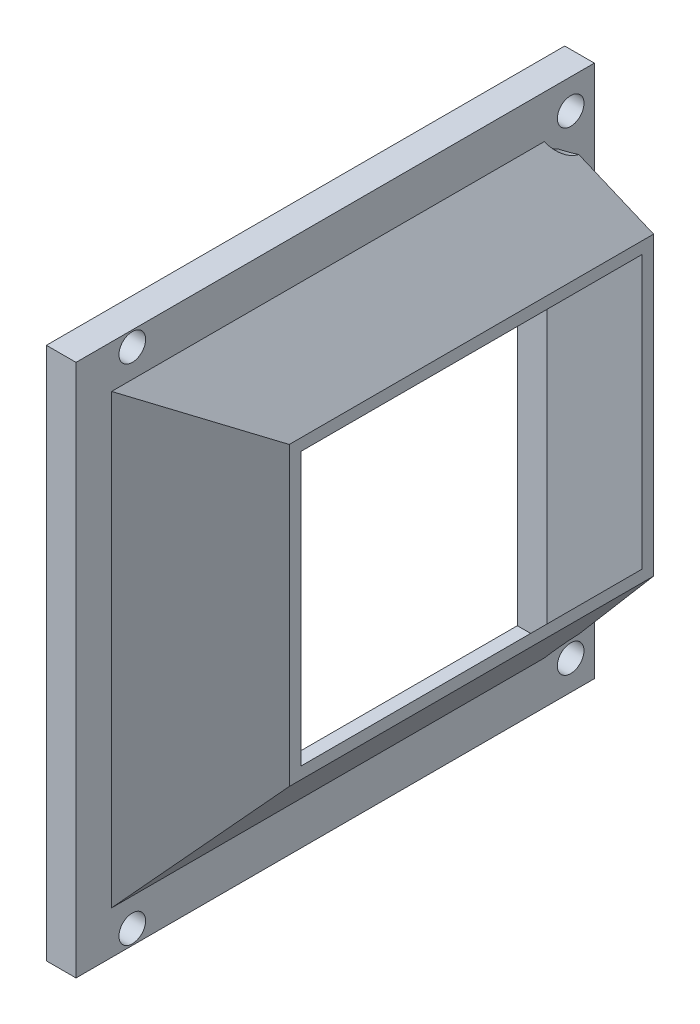
ISO-10303-21;
HEADER;
FILE_DESCRIPTION(('STEP AP214'),'2;1');
FILE_NAME('part.step','',(''),(''),'','','');
FILE_SCHEMA(('AUTOMOTIVE_DESIGN { 1 0 10303 214 1 1 1 1 }'));
ENDSEC;
DATA;
#1=APPLICATION_CONTEXT('core data for automotive mechanical design processes');
#2=APPLICATION_PROTOCOL_DEFINITION('international standard','automotive_design',2000,#1);
#3=PRODUCT_CONTEXT('',#1,'mechanical');
#4=PRODUCT('Part','Part','',(#3));
#5=PRODUCT_RELATED_PRODUCT_CATEGORY('part','',(#4));
#6=PRODUCT_DEFINITION_FORMATION('','',#4);
#7=PRODUCT_DEFINITION_CONTEXT('part definition',#1,'design');
#8=PRODUCT_DEFINITION('design','',#6,#7);
#9=PRODUCT_DEFINITION_SHAPE('','',#8);
#10=(LENGTH_UNIT() NAMED_UNIT(*) SI_UNIT(.MILLI.,.METRE.));
#11=(NAMED_UNIT(*) PLANE_ANGLE_UNIT() SI_UNIT($,.RADIAN.));
#12=(NAMED_UNIT(*) SI_UNIT($,.STERADIAN.) SOLID_ANGLE_UNIT());
#13=UNCERTAINTY_MEASURE_WITH_UNIT(LENGTH_MEASURE(1.E-05),#10,'distance_accuracy_value','');
#14=(GEOMETRIC_REPRESENTATION_CONTEXT(3) GLOBAL_UNCERTAINTY_ASSIGNED_CONTEXT((#13)) GLOBAL_UNIT_ASSIGNED_CONTEXT((#10,
#11,#12)) REPRESENTATION_CONTEXT('',''));
#15=CARTESIAN_POINT('',(0.,0.,0.));
#16=DIRECTION('',(0.,0.,1.));
#17=DIRECTION('',(1.,0.,0.));
#18=AXIS2_PLACEMENT_3D('',#15,#16,#17);
#19=CARTESIAN_POINT('',(15.,-45.,-43.75));
#20=DIRECTION('',(-0.514495755427526,0.,-0.857492925712544));
#21=DIRECTION('',(-0.857492925712544,0.,0.514495755427526));
#22=AXIS2_PLACEMENT_3D('',#19,#20,#21);
#23=PLANE('',#22);
#24=DIRECTION('',(0.,1.,0.));
#25=VECTOR('',#24,1.);
#26=CARTESIAN_POINT('',(5.,-45.,-37.75));
#27=LINE('',#26,#25);
#28=CARTESIAN_POINT('',(5.,-35.4174243050442,-37.75));
#29=VERTEX_POINT('',#28);
#30=CARTESIAN_POINT('',(5.,35.4174243050442,-37.75));
#31=VERTEX_POINT('',#30);
#32=EDGE_CURVE('E164',#29,#31,#27,.T.);
#33=ORIENTED_EDGE('',*,*,#32,.T.);
#34=CARTESIAN_POINT('',(8.33333333333333,40.,-39.75));
#35=DIRECTION('',(-0.514495755427526,0.,-0.857492925712544));
#36=DIRECTION('',(-0.857492925712544,0.,0.514495755427526));
#37=AXIS2_PLACEMENT_3D('',#34,#35,#36);
#38=ELLIPSE('',#37,9.71825315807549,5.);
#39=CARTESIAN_POINT('',(7.1147051926827,35.0537508793296,-39.0188231156096));
#40=VERTEX_POINT('',#39);
#41=EDGE_CURVE('E168',#31,#40,#38,.F.);
#42=ORIENTED_EDGE('',*,*,#41,.T.);
#43=DIRECTION('',(0.578738495143478,-0.737891581307935,-0.347243097086087));
#44=VECTOR('',#43,1.);
#45=CARTESIAN_POINT('',(-2.58425790244924,47.4199288256228,-33.1994452585305));
#46=LINE('',#45,#44);
#47=CARTESIAN_POINT('',(15.,25.0000000000001,-43.75));
#48=VERTEX_POINT('',#47);
#49=EDGE_CURVE('E323',#40,#48,#46,.T.);
#50=ORIENTED_EDGE('',*,*,#49,.T.);
#51=DIRECTION('',(0.,-1.,0.));
#52=VECTOR('',#51,1.);
#53=CARTESIAN_POINT('',(15.,23.,-43.75));
#54=LINE('',#53,#52);
#55=CARTESIAN_POINT('',(15.,-25.,-43.75));
#56=VERTEX_POINT('',#55);
#57=EDGE_CURVE('E330',#48,#56,#54,.T.);
#58=ORIENTED_EDGE('',*,*,#57,.T.);
#59=DIRECTION('',(-0.578738495143478,-0.737891581307935,0.347243097086087));
#60=VECTOR('',#59,1.);
#61=CARTESIAN_POINT('',(-11.3784802177099,-58.6325622775801,-27.9229118693741));
#62=LINE('',#61,#60);
#63=CARTESIAN_POINT('',(7.11470519268268,-35.0537508793296,-39.0188231156096));
#64=VERTEX_POINT('',#63);
#65=EDGE_CURVE('E166',#56,#64,#62,.T.);
#66=ORIENTED_EDGE('',*,*,#65,.T.);
#67=CARTESIAN_POINT('',(8.33333333333333,-40.,-39.75));
#68=DIRECTION('',(-0.514495755427526,0.,-0.857492925712544));
#69=DIRECTION('',(-0.857492925712544,0.,0.514495755427526));
#70=AXIS2_PLACEMENT_3D('',#67,#68,#69);
#71=ELLIPSE('',#70,9.71825315807549,5.);
#72=EDGE_CURVE('E154',#64,#29,#71,.F.);
#73=ORIENTED_EDGE('',*,*,#72,.T.);
#74=EDGE_LOOP('',(#33,#42,#50,#58,#66,#73));
#75=FACE_BOUND('',#74,.T.);
#76=ADVANCED_FACE('F38',(#75),#23,.T.);
#77=CARTESIAN_POINT('',(15.,25.,43.75));
#78=DIRECTION('',(0.786853417355905,0.617139935181102,0.));
#79=DIRECTION('',(-0.617139935181102,0.786853417355905,0.));
#80=AXIS2_PLACEMENT_3D('',#77,#78,#79);
#81=PLANE('',#80);
#82=ORIENTED_EDGE('',*,*,#49,.F.);
#83=CARTESIAN_POINT('',(3.23529411764705,40.,-39.75));
#84=DIRECTION('',(0.786853417355905,0.617139935181102,0.));
#85=DIRECTION('',(-0.617139935181102,0.786853417355905,0.));
#86=AXIS2_PLACEMENT_3D('',#83,#84,#85);
#87=ELLIPSE('',#86,6.35442369533286,5.);
#88=CARTESIAN_POINT('',(5.,37.75,-35.2848572251271));
#89=VERTEX_POINT('',#88);
#90=EDGE_CURVE('E11',#40,#89,#87,.F.);
#91=ORIENTED_EDGE('',*,*,#90,.T.);
#92=DIRECTION('',(0.,0.,-1.));
#93=VECTOR('',#92,1.);
#94=CARTESIAN_POINT('',(5.,37.75,43.75));
#95=LINE('',#94,#93);
#96=CARTESIAN_POINT('',(5.,37.75,37.75));
#97=VERTEX_POINT('',#96);
#98=EDGE_CURVE('E333',#97,#89,#95,.T.);
#99=ORIENTED_EDGE('',*,*,#98,.F.);
#100=DIRECTION('',(-0.388496020091119,0.495332425616176,0.776992040182238));
#101=VECTOR('',#100,1.);
#102=CARTESIAN_POINT('',(7.15168380341477,35.0066031506462,33.4466323931704));
#103=LINE('',#102,#101);
#104=CARTESIAN_POINT('',(15.,25.,17.75));
#105=VERTEX_POINT('',#104);
#106=EDGE_CURVE('E356',#105,#97,#103,.T.);
#107=ORIENTED_EDGE('',*,*,#106,.F.);
#108=DIRECTION('',(0.,0.,-1.));
#109=VECTOR('',#108,1.);
#110=CARTESIAN_POINT('',(15.,25.,43.75));
#111=LINE('',#110,#109);
#112=EDGE_CURVE('E339',#105,#48,#111,.T.);
#113=ORIENTED_EDGE('',*,*,#112,.T.);
#114=EDGE_LOOP('',(#82,#91,#99,#107,#113));
#115=FACE_BOUND('',#114,.T.);
#116=ADVANCED_FACE('F362',(#115),#81,.T.);
#117=CARTESIAN_POINT('',(5.,-37.75,43.75));
#118=DIRECTION('',(0.786853417355905,-0.617139935181102,0.));
#119=DIRECTION('',(0.617139935181102,0.786853417355905,0.));
#120=AXIS2_PLACEMENT_3D('',#117,#118,#119);
#121=PLANE('',#120);
#122=DIRECTION('',(0.,0.,-1.));
#123=VECTOR('',#122,1.);
#124=CARTESIAN_POINT('',(5.,-37.75,43.75));
#125=LINE('',#124,#123);
#126=CARTESIAN_POINT('',(5.,-37.75,37.75));
#127=VERTEX_POINT('',#126);
#128=CARTESIAN_POINT('',(5.,-37.75,-35.2848572251271));
#129=VERTEX_POINT('',#128);
#130=EDGE_CURVE('E310',#127,#129,#125,.T.);
#131=ORIENTED_EDGE('',*,*,#130,.T.);
#132=CARTESIAN_POINT('',(3.23529411764704,-40.,-39.75));
#133=DIRECTION('',(0.786853417355905,-0.617139935181102,0.));
#134=DIRECTION('',(-0.617139935181102,-0.786853417355905,0.));
#135=AXIS2_PLACEMENT_3D('',#132,#133,#134);
#136=ELLIPSE('',#135,6.35442369533286,5.);
#137=EDGE_CURVE('E47',#129,#64,#136,.F.);
#138=ORIENTED_EDGE('',*,*,#137,.T.);
#139=ORIENTED_EDGE('',*,*,#65,.F.);
#140=DIRECTION('',(0.,0.,-1.));
#141=VECTOR('',#140,1.);
#142=CARTESIAN_POINT('',(15.,-25.,43.75));
#143=LINE('',#142,#141);
#144=CARTESIAN_POINT('',(15.,-25.,17.75));
#145=VERTEX_POINT('',#144);
#146=EDGE_CURVE('E314',#145,#56,#143,.T.);
#147=ORIENTED_EDGE('',*,*,#146,.F.);
#148=DIRECTION('',(0.388496020091119,0.495332425616176,-0.776992040182238));
#149=VECTOR('',#148,1.);
#150=CARTESIAN_POINT('',(3.18885010848033,-40.0592161116876,41.3722997830393));
#151=LINE('',#150,#149);
#152=EDGE_CURVE('E311',#127,#145,#151,.T.);
#153=ORIENTED_EDGE('',*,*,#152,.F.);
#154=EDGE_LOOP('',(#131,#138,#139,#147,#153));
#155=FACE_BOUND('',#154,.T.);
#156=ADVANCED_FACE('F306',(#155),#121,.T.);
#157=CARTESIAN_POINT('',(5.,-45.,-35.75));
#158=DIRECTION('',(0.514495755427526,0.,0.857492925712544));
#159=DIRECTION('',(0.857492925712544,0.,-0.514495755427526));
#160=AXIS2_PLACEMENT_3D('',#157,#158,#159);
#161=PLANE('',#160);
#162=DIRECTION('',(-0.578738495143478,-0.737891581307935,0.347243097086087));
#163=VECTOR('',#162,1.);
#164=CARTESIAN_POINT('',(1.04982206405694,-40.7864768683274,-33.3798932384342));
#165=LINE('',#164,#163);
#166=CARTESIAN_POINT('',(15.,-23.,-41.75));
#167=VERTEX_POINT('',#166);
#168=CARTESIAN_POINT('',(5.,-35.75,-35.75));
#169=VERTEX_POINT('',#168);
#170=EDGE_CURVE('E318',#167,#169,#165,.T.);
#171=ORIENTED_EDGE('',*,*,#170,.F.);
#172=DIRECTION('',(0.,1.,0.));
#173=VECTOR('',#172,1.);
#174=CARTESIAN_POINT('',(15.,-45.,-41.75));
#175=LINE('',#174,#173);
#176=CARTESIAN_POINT('',(15.,23.,-41.75));
#177=VERTEX_POINT('',#176);
#178=EDGE_CURVE('E187',#167,#177,#175,.T.);
#179=ORIENTED_EDGE('',*,*,#178,.T.);
#180=DIRECTION('',(0.578738495143478,-0.737891581307935,-0.347243097086087));
#181=VECTOR('',#180,1.);
#182=CARTESIAN_POINT('',(39.4839857651246,-8.2170818505338,-56.4403914590747));
#183=LINE('',#182,#181);
#184=CARTESIAN_POINT('',(5.,35.7499999999999,-35.75));
#185=VERTEX_POINT('',#184);
#186=EDGE_CURVE('E348',#185,#177,#183,.T.);
#187=ORIENTED_EDGE('',*,*,#186,.F.);
#188=DIRECTION('',(0.,1.,0.));
#189=VECTOR('',#188,1.);
#190=CARTESIAN_POINT('',(5.,-35.75,-35.75));
#191=LINE('',#190,#189);
#192=EDGE_CURVE('E224',#169,#185,#191,.T.);
#193=ORIENTED_EDGE('',*,*,#192,.F.);
#194=EDGE_LOOP('',(#171,#179,#187,#193));
#195=FACE_BOUND('',#194,.T.);
#196=ADVANCED_FACE('F385',(#195),#161,.T.);
#197=CARTESIAN_POINT('',(5.,-45.,35.75));
#198=DIRECTION('',(-0.894427190999916,0.,-0.447213595499958));
#199=DIRECTION('',(-0.447213595499958,0.,0.894427190999916));
#200=AXIS2_PLACEMENT_3D('',#197,#198,#199);
#201=PLANE('',#200);
#202=DIRECTION('',(0.388496020091119,0.495332425616176,-0.776992040182238));
#203=VECTOR('',#202,1.);
#204=CARTESIAN_POINT('',(3.21997924724083,-38.0195264597679,39.3100415055183));
#205=LINE('',#204,#203);
#206=CARTESIAN_POINT('',(5.,-35.75,35.75));
#207=VERTEX_POINT('',#206);
#208=CARTESIAN_POINT('',(15.,-23.,15.75));
#209=VERTEX_POINT('',#208);
#210=EDGE_CURVE('E313',#207,#209,#205,.T.);
#211=ORIENTED_EDGE('',*,*,#210,.F.);
#212=DIRECTION('',(0.,-1.,0.));
#213=VECTOR('',#212,1.);
#214=CARTESIAN_POINT('',(5.,-35.75,35.75));
#215=LINE('',#214,#213);
#216=CARTESIAN_POINT('',(5.,35.75,35.75));
#217=VERTEX_POINT('',#216);
#218=EDGE_CURVE('E233',#217,#207,#215,.T.);
#219=ORIENTED_EDGE('',*,*,#218,.F.);
#220=DIRECTION('',(-0.388496020091119,0.495332425616176,0.776992040182238));
#221=VECTOR('',#220,1.);
#222=CARTESIAN_POINT('',(20.5391000848976,15.9376473917555,4.67179983020469));
#223=LINE('',#222,#221);
#224=CARTESIAN_POINT('',(15.,23.,15.75));
#225=VERTEX_POINT('',#224);
#226=EDGE_CURVE('E338',#225,#217,#223,.T.);
#227=ORIENTED_EDGE('',*,*,#226,.F.);
#228=DIRECTION('',(0.,1.,0.));
#229=VECTOR('',#228,1.);
#230=CARTESIAN_POINT('',(15.,-45.,15.75));
#231=LINE('',#230,#229);
#232=EDGE_CURVE('E191',#209,#225,#231,.T.);
#233=ORIENTED_EDGE('',*,*,#232,.F.);
#234=EDGE_LOOP('',(#211,#219,#227,#233));
#235=FACE_BOUND('',#234,.T.);
#236=ADVANCED_FACE('F410',(#235),#201,.T.);
#237=CARTESIAN_POINT('',(15.,-45.,17.75));
#238=DIRECTION('',(0.894427190999916,0.,0.447213595499958));
#239=DIRECTION('',(0.447213595499958,0.,-0.894427190999916));
#240=AXIS2_PLACEMENT_3D('',#237,#238,#239);
#241=PLANE('',#240);
#242=DIRECTION('',(0.,1.,0.));
#243=VECTOR('',#242,1.);
#244=CARTESIAN_POINT('',(5.,-45.,37.75));
#245=LINE('',#244,#243);
#246=EDGE_CURVE('E185',#127,#97,#245,.T.);
#247=ORIENTED_EDGE('',*,*,#246,.F.);
#248=ORIENTED_EDGE('',*,*,#152,.T.);
#249=DIRECTION('',(0.,1.,0.));
#250=VECTOR('',#249,1.);
#251=CARTESIAN_POINT('',(15.,-45.,17.75));
#252=LINE('',#251,#250);
#253=EDGE_CURVE('E62',#145,#105,#252,.T.);
#254=ORIENTED_EDGE('',*,*,#253,.T.);
#255=ORIENTED_EDGE('',*,*,#106,.T.);
#256=EDGE_LOOP('',(#247,#248,#254,#255));
#257=FACE_BOUND('',#256,.T.);
#258=ADVANCED_FACE('F357',(#257),#241,.T.);
#259=CARTESIAN_POINT('',(5.,0.,0.));
#260=DIRECTION('',(-1.,0.,0.));
#261=DIRECTION('',(0.,0.,1.));
#262=AXIS2_PLACEMENT_3D('',#259,#260,#261);
#263=PLANE('',#262);
#264=CARTESIAN_POINT('',(5.,40.,-39.75));
#265=DIRECTION('',(1.,0.,0.));
#266=DIRECTION('',(0.,0.,-1.));
#267=AXIS2_PLACEMENT_3D('',#264,#265,#266);
#268=CIRCLE('',#267,5.);
#269=EDGE_CURVE('E158',#89,#31,#268,.T.);
#270=ORIENTED_EDGE('',*,*,#269,.T.);
#271=ORIENTED_EDGE('',*,*,#32,.F.);
#272=CARTESIAN_POINT('',(5.,-40.,-39.75));
#273=DIRECTION('',(1.,0.,0.));
#274=DIRECTION('',(0.,0.,-1.));
#275=AXIS2_PLACEMENT_3D('',#272,#273,#274);
#276=CIRCLE('',#275,5.);
#277=EDGE_CURVE('E54',#29,#129,#276,.T.);
#278=ORIENTED_EDGE('',*,*,#277,.T.);
#279=ORIENTED_EDGE('',*,*,#130,.F.);
#280=ORIENTED_EDGE('',*,*,#246,.T.);
#281=ORIENTED_EDGE('',*,*,#98,.T.);
#282=EDGE_LOOP('',(#270,#271,#278,#279,#280,#281));
#283=FACE_BOUND('',#282,.T.);
#284=DIRECTION('',(0.,1.,0.));
#285=VECTOR('',#284,1.);
#286=CARTESIAN_POINT('',(5.,-45.,-43.75));
#287=LINE('',#286,#285);
#288=CARTESIAN_POINT('',(5.,-45.,-43.75));
#289=VERTEX_POINT('',#288);
#290=CARTESIAN_POINT('',(5.,45.,-43.75));
#291=VERTEX_POINT('',#290);
#292=EDGE_CURVE('E270',#289,#291,#287,.T.);
#293=ORIENTED_EDGE('',*,*,#292,.T.);
#294=DIRECTION('',(0.,0.,1.));
#295=VECTOR('',#294,1.);
#296=CARTESIAN_POINT('',(5.,45.,43.75));
#297=LINE('',#296,#295);
#298=CARTESIAN_POINT('',(5.,45.,43.75));
#299=VERTEX_POINT('',#298);
#300=EDGE_CURVE('E273',#291,#299,#297,.T.);
#301=ORIENTED_EDGE('',*,*,#300,.T.);
#302=DIRECTION('',(0.,-1.,0.));
#303=VECTOR('',#302,1.);
#304=CARTESIAN_POINT('',(5.,-45.,43.75));
#305=LINE('',#304,#303);
#306=CARTESIAN_POINT('',(5.,-45.,43.75));
#307=VERTEX_POINT('',#306);
#308=EDGE_CURVE('E277',#299,#307,#305,.T.);
#309=ORIENTED_EDGE('',*,*,#308,.T.);
#310=DIRECTION('',(0.,0.,-1.));
#311=VECTOR('',#310,1.);
#312=CARTESIAN_POINT('',(5.,-45.,43.75));
#313=LINE('',#312,#311);
#314=EDGE_CURVE('E280',#307,#289,#313,.T.);
#315=ORIENTED_EDGE('',*,*,#314,.T.);
#316=EDGE_LOOP('',(#293,#301,#309,#315));
#317=FACE_BOUND('',#316,.T.);
#318=CARTESIAN_POINT('',(5.,42.5,34.25));
#319=DIRECTION('',(1.,0.,0.));
#320=DIRECTION('',(0.,0.,-1.));
#321=AXIS2_PLACEMENT_3D('',#318,#319,#320);
#322=CIRCLE('',#321,2.24999999999999);
#323=CARTESIAN_POINT('',(5.,42.5,32.));
#324=VERTEX_POINT('',#323);
#325=EDGE_CURVE('E207',#324,#324,#322,.T.);
#326=ORIENTED_EDGE('',*,*,#325,.F.);
#327=EDGE_LOOP('',(#326));
#328=FACE_BOUND('',#327,.T.);
#329=CARTESIAN_POINT('',(5.,-42.5,34.25));
#330=DIRECTION('',(1.,0.,0.));
#331=DIRECTION('',(0.,0.,-1.));
#332=AXIS2_PLACEMENT_3D('',#329,#330,#331);
#333=CIRCLE('',#332,2.24999999999999);
#334=CARTESIAN_POINT('',(5.,-42.5,32.));
#335=VERTEX_POINT('',#334);
#336=EDGE_CURVE('E190',#335,#335,#333,.T.);
#337=ORIENTED_EDGE('',*,*,#336,.F.);
#338=EDGE_LOOP('',(#337));
#339=FACE_BOUND('',#338,.T.);
#340=CARTESIAN_POINT('',(5.,-40.,-39.75));
#341=DIRECTION('',(1.,0.,0.));
#342=DIRECTION('',(0.,0.,-1.));
#343=AXIS2_PLACEMENT_3D('',#340,#341,#342);
#344=CIRCLE('',#343,2.24999999999999);
#345=CARTESIAN_POINT('',(5.,-40.,-42.));
#346=VERTEX_POINT('',#345);
#347=EDGE_CURVE('E199',#346,#346,#344,.T.);
#348=ORIENTED_EDGE('',*,*,#347,.F.);
#349=EDGE_LOOP('',(#348));
#350=FACE_BOUND('',#349,.T.);
#351=CARTESIAN_POINT('',(5.,40.,-39.75));
#352=DIRECTION('',(1.,0.,0.));
#353=DIRECTION('',(0.,0.,-1.));
#354=AXIS2_PLACEMENT_3D('',#351,#352,#353);
#355=CIRCLE('',#354,2.24999999999999);
#356=CARTESIAN_POINT('',(5.,40.,-42.));
#357=VERTEX_POINT('',#356);
#358=EDGE_CURVE('E215',#357,#357,#355,.T.);
#359=ORIENTED_EDGE('',*,*,#358,.F.);
#360=EDGE_LOOP('',(#359));
#361=FACE_BOUND('',#360,.T.);
#362=ADVANCED_FACE('F171',(#283,#317,#328,#339,#350,#361),#263,.F.);
#363=CARTESIAN_POINT('',(0.,0.,0.));
#364=DIRECTION('',(-1.,0.,0.));
#365=DIRECTION('',(0.,0.,1.));
#366=AXIS2_PLACEMENT_3D('',#363,#364,#365);
#367=PLANE('',#366);
#368=CARTESIAN_POINT('',(0.,-42.5,34.25));
#369=DIRECTION('',(1.,0.,0.));
#370=DIRECTION('',(0.,0.,-1.));
#371=AXIS2_PLACEMENT_3D('',#368,#369,#370);
#372=CIRCLE('',#371,2.25);
#373=CARTESIAN_POINT('',(0.,-42.5,32.));
#374=VERTEX_POINT('',#373);
#375=EDGE_CURVE('E195',#374,#374,#372,.T.);
#376=ORIENTED_EDGE('',*,*,#375,.T.);
#377=EDGE_LOOP('',(#376));
#378=FACE_BOUND('',#377,.T.);
#379=CARTESIAN_POINT('',(0.,-40.,-39.75));
#380=DIRECTION('',(1.,0.,0.));
#381=DIRECTION('',(0.,0.,-1.));
#382=AXIS2_PLACEMENT_3D('',#379,#380,#381);
#383=CIRCLE('',#382,2.25);
#384=CARTESIAN_POINT('',(0.,-40.,-42.));
#385=VERTEX_POINT('',#384);
#386=EDGE_CURVE('E203',#385,#385,#383,.T.);
#387=ORIENTED_EDGE('',*,*,#386,.T.);
#388=EDGE_LOOP('',(#387));
#389=FACE_BOUND('',#388,.T.);
#390=CARTESIAN_POINT('',(0.,42.5,34.25));
#391=DIRECTION('',(1.,0.,0.));
#392=DIRECTION('',(0.,0.,-1.));
#393=AXIS2_PLACEMENT_3D('',#390,#391,#392);
#394=CIRCLE('',#393,2.25);
#395=CARTESIAN_POINT('',(0.,42.5,32.));
#396=VERTEX_POINT('',#395);
#397=EDGE_CURVE('E211',#396,#396,#394,.T.);
#398=ORIENTED_EDGE('',*,*,#397,.T.);
#399=EDGE_LOOP('',(#398));
#400=FACE_BOUND('',#399,.T.);
#401=CARTESIAN_POINT('',(0.,40.,-39.75));
#402=DIRECTION('',(1.,0.,0.));
#403=DIRECTION('',(0.,0.,-1.));
#404=AXIS2_PLACEMENT_3D('',#401,#402,#403);
#405=CIRCLE('',#404,2.25);
#406=CARTESIAN_POINT('',(0.,40.,-42.));
#407=VERTEX_POINT('',#406);
#408=EDGE_CURVE('E219',#407,#407,#405,.T.);
#409=ORIENTED_EDGE('',*,*,#408,.T.);
#410=EDGE_LOOP('',(#409));
#411=FACE_BOUND('',#410,.T.);
#412=DIRECTION('',(0.,1.,0.));
#413=VECTOR('',#412,1.);
#414=CARTESIAN_POINT('',(0.,-45.,-43.75));
#415=LINE('',#414,#413);
#416=CARTESIAN_POINT('',(0.,-45.,-43.75));
#417=VERTEX_POINT('',#416);
#418=CARTESIAN_POINT('',(0.,45.,-43.75));
#419=VERTEX_POINT('',#418);
#420=EDGE_CURVE('E269',#417,#419,#415,.T.);
#421=ORIENTED_EDGE('',*,*,#420,.F.);
#422=DIRECTION('',(0.,0.,-1.));
#423=VECTOR('',#422,1.);
#424=CARTESIAN_POINT('',(0.,-45.,43.75));
#425=LINE('',#424,#423);
#426=CARTESIAN_POINT('',(0.,-45.,43.75));
#427=VERTEX_POINT('',#426);
#428=EDGE_CURVE('E274',#427,#417,#425,.T.);
#429=ORIENTED_EDGE('',*,*,#428,.F.);
#430=DIRECTION('',(0.,-1.,0.));
#431=VECTOR('',#430,1.);
#432=CARTESIAN_POINT('',(0.,-45.,43.75));
#433=LINE('',#432,#431);
#434=CARTESIAN_POINT('',(0.,45.,43.75));
#435=VERTEX_POINT('',#434);
#436=EDGE_CURVE('E290',#435,#427,#433,.T.);
#437=ORIENTED_EDGE('',*,*,#436,.F.);
#438=DIRECTION('',(0.,0.,1.));
#439=VECTOR('',#438,1.);
#440=CARTESIAN_POINT('',(0.,45.,43.75));
#441=LINE('',#440,#439);
#442=EDGE_CURVE('E287',#419,#435,#441,.T.);
#443=ORIENTED_EDGE('',*,*,#442,.F.);
#444=EDGE_LOOP('',(#421,#429,#437,#443));
#445=FACE_BOUND('',#444,.T.);
#446=DIRECTION('',(0.,0.,-1.));
#447=VECTOR('',#446,1.);
#448=CARTESIAN_POINT('',(0.,-35.75,35.75));
#449=LINE('',#448,#447);
#450=CARTESIAN_POINT('',(0.,-35.75,35.75));
#451=VERTEX_POINT('',#450);
#452=CARTESIAN_POINT('',(0.,-35.75,-35.75));
#453=VERTEX_POINT('',#452);
#454=EDGE_CURVE('E229',#451,#453,#449,.T.);
#455=ORIENTED_EDGE('',*,*,#454,.T.);
#456=DIRECTION('',(0.,1.,0.));
#457=VECTOR('',#456,1.);
#458=CARTESIAN_POINT('',(0.,-35.75,-35.75));
#459=LINE('',#458,#457);
#460=CARTESIAN_POINT('',(0.,35.75,-35.75));
#461=VERTEX_POINT('',#460);
#462=EDGE_CURVE('E223',#453,#461,#459,.T.);
#463=ORIENTED_EDGE('',*,*,#462,.T.);
#464=DIRECTION('',(0.,0.,1.));
#465=VECTOR('',#464,1.);
#466=CARTESIAN_POINT('',(0.,35.75,35.75));
#467=LINE('',#466,#465);
#468=CARTESIAN_POINT('',(0.,35.75,35.75));
#469=VERTEX_POINT('',#468);
#470=EDGE_CURVE('E245',#461,#469,#467,.T.);
#471=ORIENTED_EDGE('',*,*,#470,.T.);
#472=DIRECTION('',(0.,-1.,0.));
#473=VECTOR('',#472,1.);
#474=CARTESIAN_POINT('',(0.,-35.75,35.75));
#475=LINE('',#474,#473);
#476=EDGE_CURVE('E249',#469,#451,#475,.T.);
#477=ORIENTED_EDGE('',*,*,#476,.T.);
#478=EDGE_LOOP('',(#455,#463,#471,#477));
#479=FACE_BOUND('',#478,.T.);
#480=ADVANCED_FACE('F400',(#378,#389,#400,#411,#445,#479),#367,.T.);
#481=CARTESIAN_POINT('',(5.,-45.,-43.75));
#482=DIRECTION('',(0.,0.,1.));
#483=DIRECTION('',(1.,0.,0.));
#484=AXIS2_PLACEMENT_3D('',#481,#482,#483);
#485=PLANE('',#484);
#486=DIRECTION('',(-1.,0.,0.));
#487=VECTOR('',#486,1.);
#488=CARTESIAN_POINT('',(5.,45.,-43.75));
#489=LINE('',#488,#487);
#490=EDGE_CURVE('E175',#291,#419,#489,.T.);
#491=ORIENTED_EDGE('',*,*,#490,.F.);
#492=ORIENTED_EDGE('',*,*,#292,.F.);
#493=DIRECTION('',(-1.,0.,0.));
#494=VECTOR('',#493,1.);
#495=CARTESIAN_POINT('',(5.,-45.,-43.75));
#496=LINE('',#495,#494);
#497=EDGE_CURVE('E283',#289,#417,#496,.T.);
#498=ORIENTED_EDGE('',*,*,#497,.T.);
#499=ORIENTED_EDGE('',*,*,#420,.T.);
#500=EDGE_LOOP('',(#491,#492,#498,#499));
#501=FACE_BOUND('',#500,.T.);
#502=ADVANCED_FACE('F40',(#501),#485,.F.);
#503=CARTESIAN_POINT('',(5.,45.,43.75));
#504=DIRECTION('',(0.,-1.,0.));
#505=DIRECTION('',(0.,0.,-1.));
#506=AXIS2_PLACEMENT_3D('',#503,#504,#505);
#507=PLANE('',#506);
#508=DIRECTION('',(-1.,0.,0.));
#509=VECTOR('',#508,1.);
#510=CARTESIAN_POINT('',(5.,45.,43.75));
#511=LINE('',#510,#509);
#512=EDGE_CURVE('E181',#299,#435,#511,.T.);
#513=ORIENTED_EDGE('',*,*,#512,.F.);
#514=ORIENTED_EDGE('',*,*,#300,.F.);
#515=ORIENTED_EDGE('',*,*,#490,.T.);
#516=ORIENTED_EDGE('',*,*,#442,.T.);
#517=EDGE_LOOP('',(#513,#514,#515,#516));
#518=FACE_BOUND('',#517,.T.);
#519=ADVANCED_FACE('F461',(#518),#507,.F.);
#520=CARTESIAN_POINT('',(5.,-45.,43.75));
#521=DIRECTION('',(0.,0.,-1.));
#522=DIRECTION('',(-1.,0.,0.));
#523=AXIS2_PLACEMENT_3D('',#520,#521,#522);
#524=PLANE('',#523);
#525=DIRECTION('',(-1.,0.,0.));
#526=VECTOR('',#525,1.);
#527=CARTESIAN_POINT('',(5.,-45.,43.75));
#528=LINE('',#527,#526);
#529=EDGE_CURVE('E298',#307,#427,#528,.T.);
#530=ORIENTED_EDGE('',*,*,#529,.F.);
#531=ORIENTED_EDGE('',*,*,#308,.F.);
#532=ORIENTED_EDGE('',*,*,#512,.T.);
#533=ORIENTED_EDGE('',*,*,#436,.T.);
#534=EDGE_LOOP('',(#530,#531,#532,#533));
#535=FACE_BOUND('',#534,.T.);
#536=ADVANCED_FACE('F458',(#535),#524,.F.);
#537=CARTESIAN_POINT('',(5.,-45.,43.75));
#538=DIRECTION('',(0.,1.,0.));
#539=DIRECTION('',(0.,0.,1.));
#540=AXIS2_PLACEMENT_3D('',#537,#538,#539);
#541=PLANE('',#540);
#542=ORIENTED_EDGE('',*,*,#497,.F.);
#543=ORIENTED_EDGE('',*,*,#314,.F.);
#544=ORIENTED_EDGE('',*,*,#529,.T.);
#545=ORIENTED_EDGE('',*,*,#428,.T.);
#546=EDGE_LOOP('',(#542,#543,#544,#545));
#547=FACE_BOUND('',#546,.T.);
#548=ADVANCED_FACE('F450',(#547),#541,.F.);
#549=CARTESIAN_POINT('',(5.,-35.75,-35.75));
#550=DIRECTION('',(0.,0.,1.));
#551=DIRECTION('',(1.,0.,0.));
#552=AXIS2_PLACEMENT_3D('',#549,#550,#551);
#553=PLANE('',#552);
#554=ORIENTED_EDGE('',*,*,#462,.F.);
#555=DIRECTION('',(-1.,0.,0.));
#556=VECTOR('',#555,1.);
#557=CARTESIAN_POINT('',(5.,-35.75,-35.75));
#558=LINE('',#557,#556);
#559=EDGE_CURVE('E241',#169,#453,#558,.T.);
#560=ORIENTED_EDGE('',*,*,#559,.F.);
#561=ORIENTED_EDGE('',*,*,#192,.T.);
#562=DIRECTION('',(-1.,0.,0.));
#563=VECTOR('',#562,1.);
#564=CARTESIAN_POINT('',(5.,35.75,-35.75));
#565=LINE('',#564,#563);
#566=EDGE_CURVE('E265',#185,#461,#565,.T.);
#567=ORIENTED_EDGE('',*,*,#566,.T.);
#568=EDGE_LOOP('',(#554,#560,#561,#567));
#569=FACE_BOUND('',#568,.T.);
#570=ADVANCED_FACE('F402',(#569),#553,.T.);
#571=CARTESIAN_POINT('',(5.,35.75,35.75));
#572=DIRECTION('',(0.,-1.,0.));
#573=DIRECTION('',(0.,0.,-1.));
#574=AXIS2_PLACEMENT_3D('',#571,#572,#573);
#575=PLANE('',#574);
#576=ORIENTED_EDGE('',*,*,#470,.F.);
#577=ORIENTED_EDGE('',*,*,#566,.F.);
#578=DIRECTION('',(0.,0.,1.));
#579=VECTOR('',#578,1.);
#580=CARTESIAN_POINT('',(5.,35.75,35.75));
#581=LINE('',#580,#579);
#582=EDGE_CURVE('E228',#185,#217,#581,.T.);
#583=ORIENTED_EDGE('',*,*,#582,.T.);
#584=DIRECTION('',(-1.,0.,0.));
#585=VECTOR('',#584,1.);
#586=CARTESIAN_POINT('',(5.,35.75,35.75));
#587=LINE('',#586,#585);
#588=EDGE_CURVE('E262',#217,#469,#587,.T.);
#589=ORIENTED_EDGE('',*,*,#588,.T.);
#590=EDGE_LOOP('',(#576,#577,#583,#589));
#591=FACE_BOUND('',#590,.T.);
#592=ADVANCED_FACE('F393',(#591),#575,.T.);
#593=CARTESIAN_POINT('',(5.,-35.75,35.75));
#594=DIRECTION('',(0.,0.,-1.));
#595=DIRECTION('',(-1.,0.,0.));
#596=AXIS2_PLACEMENT_3D('',#593,#594,#595);
#597=PLANE('',#596);
#598=ORIENTED_EDGE('',*,*,#476,.F.);
#599=ORIENTED_EDGE('',*,*,#588,.F.);
#600=ORIENTED_EDGE('',*,*,#218,.T.);
#601=DIRECTION('',(-1.,0.,0.));
#602=VECTOR('',#601,1.);
#603=CARTESIAN_POINT('',(5.,-35.75,35.75));
#604=LINE('',#603,#602);
#605=EDGE_CURVE('E259',#207,#451,#604,.T.);
#606=ORIENTED_EDGE('',*,*,#605,.T.);
#607=EDGE_LOOP('',(#598,#599,#600,#606));
#608=FACE_BOUND('',#607,.T.);
#609=ADVANCED_FACE('F396',(#608),#597,.T.);
#610=CARTESIAN_POINT('',(5.,-35.75,35.75));
#611=DIRECTION('',(0.,1.,0.));
#612=DIRECTION('',(0.,0.,1.));
#613=AXIS2_PLACEMENT_3D('',#610,#611,#612);
#614=PLANE('',#613);
#615=ORIENTED_EDGE('',*,*,#454,.F.);
#616=ORIENTED_EDGE('',*,*,#605,.F.);
#617=DIRECTION('',(0.,0.,-1.));
#618=VECTOR('',#617,1.);
#619=CARTESIAN_POINT('',(5.,-35.75,35.75));
#620=LINE('',#619,#618);
#621=EDGE_CURVE('E237',#207,#169,#620,.T.);
#622=ORIENTED_EDGE('',*,*,#621,.T.);
#623=ORIENTED_EDGE('',*,*,#559,.T.);
#624=EDGE_LOOP('',(#615,#616,#622,#623));
#625=FACE_BOUND('',#624,.T.);
#626=ADVANCED_FACE('F405',(#625),#614,.T.);
#627=CARTESIAN_POINT('',(5.,40.,-39.75));
#628=DIRECTION('',(1.,0.,0.));
#629=DIRECTION('',(0.,0.,-1.));
#630=AXIS2_PLACEMENT_3D('',#627,#628,#629);
#631=CYLINDRICAL_SURFACE('',#630,2.25);
#632=ORIENTED_EDGE('',*,*,#408,.F.);
#633=EDGE_LOOP('',(#632));
#634=FACE_BOUND('',#633,.T.);
#635=ORIENTED_EDGE('',*,*,#358,.T.);
#636=EDGE_LOOP('',(#635));
#637=FACE_BOUND('',#636,.T.);
#638=ADVANCED_FACE('F437',(#634,#637),#631,.F.);
#639=CARTESIAN_POINT('',(5.,42.5,34.25));
#640=DIRECTION('',(1.,0.,0.));
#641=DIRECTION('',(0.,0.,-1.));
#642=AXIS2_PLACEMENT_3D('',#639,#640,#641);
#643=CYLINDRICAL_SURFACE('',#642,2.24999999999999);
#644=ORIENTED_EDGE('',*,*,#397,.F.);
#645=EDGE_LOOP('',(#644));
#646=FACE_BOUND('',#645,.T.);
#647=ORIENTED_EDGE('',*,*,#325,.T.);
#648=EDGE_LOOP('',(#647));
#649=FACE_BOUND('',#648,.T.);
#650=ADVANCED_FACE('F433',(#646,#649),#643,.F.);
#651=CARTESIAN_POINT('',(5.,-40.,-39.75));
#652=DIRECTION('',(1.,0.,0.));
#653=DIRECTION('',(0.,0.,-1.));
#654=AXIS2_PLACEMENT_3D('',#651,#652,#653);
#655=CYLINDRICAL_SURFACE('',#654,2.25);
#656=ORIENTED_EDGE('',*,*,#386,.F.);
#657=EDGE_LOOP('',(#656));
#658=FACE_BOUND('',#657,.T.);
#659=ORIENTED_EDGE('',*,*,#347,.T.);
#660=EDGE_LOOP('',(#659));
#661=FACE_BOUND('',#660,.T.);
#662=ADVANCED_FACE('F429',(#658,#661),#655,.F.);
#663=CARTESIAN_POINT('',(5.,-42.5,34.25));
#664=DIRECTION('',(1.,0.,0.));
#665=DIRECTION('',(0.,0.,-1.));
#666=AXIS2_PLACEMENT_3D('',#663,#664,#665);
#667=CYLINDRICAL_SURFACE('',#666,2.24999999999999);
#668=ORIENTED_EDGE('',*,*,#375,.F.);
#669=EDGE_LOOP('',(#668));
#670=FACE_BOUND('',#669,.T.);
#671=ORIENTED_EDGE('',*,*,#336,.T.);
#672=EDGE_LOOP('',(#671));
#673=FACE_BOUND('',#672,.T.);
#674=ADVANCED_FACE('F377',(#670,#673),#667,.F.);
#675=CARTESIAN_POINT('',(15.,-45.,-41.75));
#676=DIRECTION('',(1.,0.,0.));
#677=DIRECTION('',(0.,0.,-1.));
#678=AXIS2_PLACEMENT_3D('',#675,#676,#677);
#679=PLANE('',#678);
#680=ORIENTED_EDGE('',*,*,#253,.F.);
#681=ORIENTED_EDGE('',*,*,#146,.T.);
#682=ORIENTED_EDGE('',*,*,#57,.F.);
#683=ORIENTED_EDGE('',*,*,#112,.F.);
#684=EDGE_LOOP('',(#680,#681,#682,#683));
#685=FACE_BOUND('',#684,.T.);
#686=ORIENTED_EDGE('',*,*,#178,.F.);
#687=DIRECTION('',(0.,0.,-1.));
#688=VECTOR('',#687,1.);
#689=CARTESIAN_POINT('',(15.,-23.,43.75));
#690=LINE('',#689,#688);
#691=EDGE_CURVE('E320',#209,#167,#690,.T.);
#692=ORIENTED_EDGE('',*,*,#691,.F.);
#693=ORIENTED_EDGE('',*,*,#232,.T.);
#694=DIRECTION('',(0.,0.,-1.));
#695=VECTOR('',#694,1.);
#696=CARTESIAN_POINT('',(15.,23.,43.75));
#697=LINE('',#696,#695);
#698=EDGE_CURVE('E334',#225,#177,#697,.T.);
#699=ORIENTED_EDGE('',*,*,#698,.T.);
#700=EDGE_LOOP('',(#686,#692,#693,#699));
#701=FACE_BOUND('',#700,.T.);
#702=ADVANCED_FACE('F373',(#685,#701),#679,.T.);
#703=CARTESIAN_POINT('',(5.,35.75,43.75));
#704=DIRECTION('',(-0.786853417355905,-0.617139935181102,0.));
#705=DIRECTION('',(0.617139935181102,-0.786853417355905,0.));
#706=AXIS2_PLACEMENT_3D('',#703,#704,#705);
#707=PLANE('',#706);
#708=ORIENTED_EDGE('',*,*,#582,.F.);
#709=ORIENTED_EDGE('',*,*,#186,.T.);
#710=ORIENTED_EDGE('',*,*,#698,.F.);
#711=ORIENTED_EDGE('',*,*,#226,.T.);
#712=EDGE_LOOP('',(#708,#709,#710,#711));
#713=FACE_BOUND('',#712,.T.);
#714=ADVANCED_FACE('F376',(#713),#707,.T.);
#715=CARTESIAN_POINT('',(15.,-23.,43.75));
#716=DIRECTION('',(-0.786853417355905,0.617139935181102,0.));
#717=DIRECTION('',(-0.617139935181102,-0.786853417355905,0.));
#718=AXIS2_PLACEMENT_3D('',#715,#716,#717);
#719=PLANE('',#718);
#720=ORIENTED_EDGE('',*,*,#691,.T.);
#721=ORIENTED_EDGE('',*,*,#170,.T.);
#722=ORIENTED_EDGE('',*,*,#621,.F.);
#723=ORIENTED_EDGE('',*,*,#210,.T.);
#724=EDGE_LOOP('',(#720,#721,#722,#723));
#725=FACE_BOUND('',#724,.T.);
#726=ADVANCED_FACE('F408',(#725),#719,.T.);
#727=CARTESIAN_POINT('',(15.,-40.,-39.75));
#728=DIRECTION('',(-1.,0.,0.));
#729=DIRECTION('',(0.,0.,1.));
#730=AXIS2_PLACEMENT_3D('',#727,#728,#729);
#731=CYLINDRICAL_SURFACE('',#730,5.);
#732=ORIENTED_EDGE('',*,*,#137,.F.);
#733=ORIENTED_EDGE('',*,*,#277,.F.);
#734=ORIENTED_EDGE('',*,*,#72,.F.);
#735=EDGE_LOOP('',(#732,#733,#734));
#736=FACE_BOUND('',#735,.T.);
#737=ADVANCED_FACE('F153',(#736),#731,.F.);
#738=CARTESIAN_POINT('',(15.,40.,-39.75));
#739=DIRECTION('',(-1.,0.,0.));
#740=DIRECTION('',(0.,0.,1.));
#741=AXIS2_PLACEMENT_3D('',#738,#739,#740);
#742=CYLINDRICAL_SURFACE('',#741,5.);
#743=ORIENTED_EDGE('',*,*,#269,.F.);
#744=ORIENTED_EDGE('',*,*,#90,.F.);
#745=ORIENTED_EDGE('',*,*,#41,.F.);
#746=EDGE_LOOP('',(#743,#744,#745));
#747=FACE_BOUND('',#746,.T.);
#748=ADVANCED_FACE('F364',(#747),#742,.F.);
#749=CLOSED_SHELL('',(#76,#116,#156,#196,#236,#258,#362,#480,#502,#519,#536,#548,#570,#592,#609,
#626,#638,#650,#662,#674,#702,#714,#726,#737,#748));
#750=MANIFOLD_SOLID_BREP('B2',#749);
#751=ADVANCED_BREP_SHAPE_REPRESENTATION('',(#18,#750),#14);
#752=SHAPE_DEFINITION_REPRESENTATION(#9,#751);
ENDSEC;
END-ISO-10303-21;
